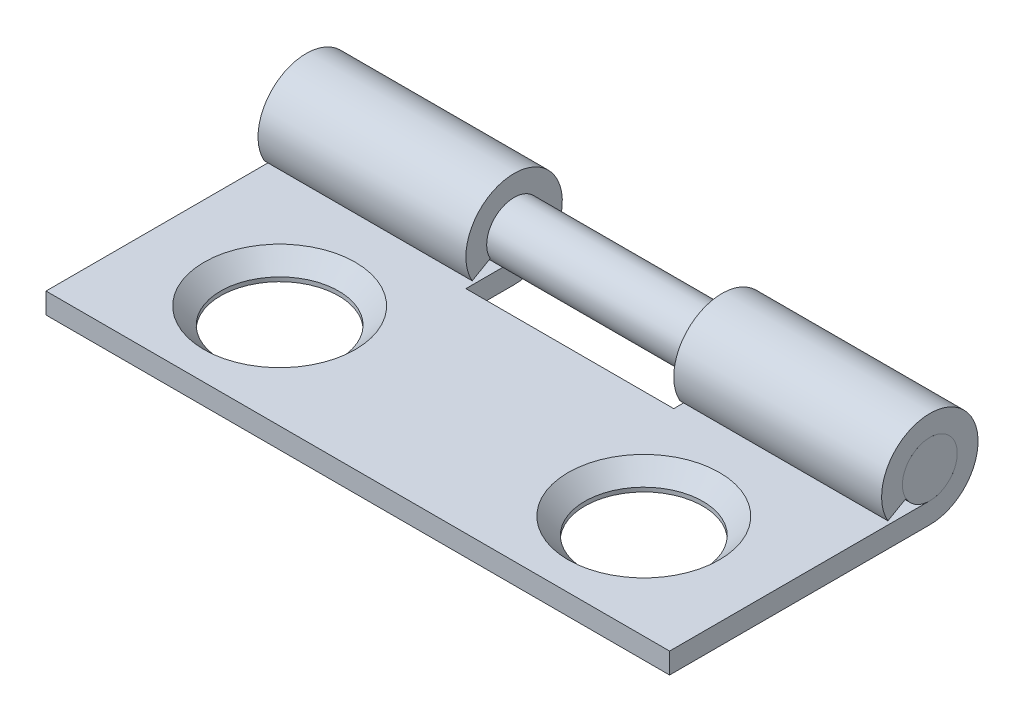
ISO-10303-21;
HEADER;
FILE_DESCRIPTION(('STEP AP214'),'2;1');
FILE_NAME('part.step','',(''),(''),'','','');
FILE_SCHEMA(('AUTOMOTIVE_DESIGN { 1 0 10303 214 1 1 1 1 }'));
ENDSEC;
DATA;
#1=APPLICATION_CONTEXT('core data for automotive mechanical design processes');
#2=APPLICATION_PROTOCOL_DEFINITION('international standard','automotive_design',2000,#1);
#3=PRODUCT_CONTEXT('',#1,'mechanical');
#4=PRODUCT('Part','Part','',(#3));
#5=PRODUCT_RELATED_PRODUCT_CATEGORY('part','',(#4));
#6=PRODUCT_DEFINITION_FORMATION('','',#4);
#7=PRODUCT_DEFINITION_CONTEXT('part definition',#1,'design');
#8=PRODUCT_DEFINITION('design','',#6,#7);
#9=PRODUCT_DEFINITION_SHAPE('','',#8);
#10=(LENGTH_UNIT() NAMED_UNIT(*) SI_UNIT(.MILLI.,.METRE.));
#11=(NAMED_UNIT(*) PLANE_ANGLE_UNIT() SI_UNIT($,.RADIAN.));
#12=(NAMED_UNIT(*) SI_UNIT($,.STERADIAN.) SOLID_ANGLE_UNIT());
#13=UNCERTAINTY_MEASURE_WITH_UNIT(LENGTH_MEASURE(1.E-05),#10,'distance_accuracy_value','');
#14=(GEOMETRIC_REPRESENTATION_CONTEXT(3) GLOBAL_UNCERTAINTY_ASSIGNED_CONTEXT((#13)) GLOBAL_UNIT_ASSIGNED_CONTEXT((#10,
#11,#12)) REPRESENTATION_CONTEXT('',''));
#15=CARTESIAN_POINT('',(0.,0.,0.));
#16=DIRECTION('',(0.,0.,1.));
#17=DIRECTION('',(1.,0.,0.));
#18=AXIS2_PLACEMENT_3D('',#15,#16,#17);
#19=CARTESIAN_POINT('',(9.525,0.,0.));
#20=DIRECTION('',(-1.,0.,0.));
#21=DIRECTION('',(0.,0.,1.));
#22=AXIS2_PLACEMENT_3D('',#19,#20,#21);
#23=CYLINDRICAL_SURFACE('',#22,0.8382);
#24=CARTESIAN_POINT('',(9.525,0.,0.));
#25=DIRECTION('',(1.,0.,0.));
#26=DIRECTION('',(0.,0.,-1.));
#27=AXIS2_PLACEMENT_3D('',#24,#25,#26);
#28=CIRCLE('',#27,0.8382);
#29=CARTESIAN_POINT('',(9.525,0.,0.8382));
#30=VERTEX_POINT('',#29);
#31=EDGE_CURVE('E11',#30,#30,#28,.T.);
#32=CARTESIAN_POINT('',(-9.525,0.,0.));
#33=DIRECTION('',(1.,0.,0.));
#34=DIRECTION('',(0.,0.,-1.));
#35=AXIS2_PLACEMENT_3D('',#32,#33,#34);
#36=CIRCLE('',#35,0.8382);
#37=CARTESIAN_POINT('',(-9.525,0.,0.8382));
#38=VERTEX_POINT('',#37);
#39=EDGE_CURVE('E56',#38,#38,#36,.T.);
#40=CARTESIAN_POINT('',(9.525,0.,0.8382));
#41=CARTESIAN_POINT('',(9.3265625,0.,0.8382));
#42=CARTESIAN_POINT('',(9.128125,0.,0.8382));
#43=CARTESIAN_POINT('',(8.73125,0.,0.8382));
#44=CARTESIAN_POINT('',(8.5328125,0.,0.8382));
#45=CARTESIAN_POINT('',(8.1359375,0.,0.8382));
#46=CARTESIAN_POINT('',(7.9375,0.,0.8382));
#47=CARTESIAN_POINT('',(7.540625,0.,0.8382));
#48=CARTESIAN_POINT('',(7.3421875,0.,0.8382));
#49=CARTESIAN_POINT('',(6.9453125,0.,0.8382));
#50=CARTESIAN_POINT('',(6.746875,0.,0.8382));
#51=CARTESIAN_POINT('',(6.35,0.,0.8382));
#52=CARTESIAN_POINT('',(6.1515625,0.,0.8382));
#53=CARTESIAN_POINT('',(5.7546875,0.,0.8382));
#54=CARTESIAN_POINT('',(5.55625,0.,0.8382));
#55=CARTESIAN_POINT('',(5.159375,0.,0.8382));
#56=CARTESIAN_POINT('',(4.9609375,0.,0.8382));
#57=CARTESIAN_POINT('',(4.5640625,0.,0.8382));
#58=CARTESIAN_POINT('',(4.365625,0.,0.8382));
#59=CARTESIAN_POINT('',(3.96875,0.,0.8382));
#60=CARTESIAN_POINT('',(3.7703125,0.,0.8382));
#61=CARTESIAN_POINT('',(3.3734375,0.,0.8382));
#62=CARTESIAN_POINT('',(3.175,0.,0.8382));
#63=CARTESIAN_POINT('',(2.778125,0.,0.8382));
#64=CARTESIAN_POINT('',(2.5796875,0.,0.8382));
#65=CARTESIAN_POINT('',(2.1828125,0.,0.8382));
#66=CARTESIAN_POINT('',(1.984375,0.,0.8382));
#67=CARTESIAN_POINT('',(1.5875,0.,0.8382));
#68=CARTESIAN_POINT('',(1.3890625,0.,0.8382));
#69=CARTESIAN_POINT('',(0.992187499999999,0.,0.8382));
#70=CARTESIAN_POINT('',(0.793749999999999,0.,0.8382));
#71=CARTESIAN_POINT('',(0.396874999999998,0.,0.8382));
#72=CARTESIAN_POINT('',(0.198437499999998,0.,0.8382));
#73=CARTESIAN_POINT('',(-0.198437500000002,0.,0.8382));
#74=CARTESIAN_POINT('',(-0.396875000000002,0.,0.8382));
#75=CARTESIAN_POINT('',(-0.793750000000002,0.,0.8382));
#76=CARTESIAN_POINT('',(-0.992187500000002,0.,0.8382));
#77=CARTESIAN_POINT('',(-1.3890625,0.,0.8382));
#78=CARTESIAN_POINT('',(-1.5875,0.,0.8382));
#79=CARTESIAN_POINT('',(-1.984375,0.,0.8382));
#80=CARTESIAN_POINT('',(-2.1828125,0.,0.8382));
#81=CARTESIAN_POINT('',(-2.5796875,0.,0.8382));
#82=CARTESIAN_POINT('',(-2.778125,0.,0.8382));
#83=CARTESIAN_POINT('',(-3.175,0.,0.8382));
#84=CARTESIAN_POINT('',(-3.3734375,0.,0.8382));
#85=CARTESIAN_POINT('',(-3.7703125,0.,0.8382));
#86=CARTESIAN_POINT('',(-3.96875,0.,0.8382));
#87=CARTESIAN_POINT('',(-4.365625,0.,0.8382));
#88=CARTESIAN_POINT('',(-4.5640625,0.,0.8382));
#89=CARTESIAN_POINT('',(-4.9609375,0.,0.8382));
#90=CARTESIAN_POINT('',(-5.159375,0.,0.8382));
#91=CARTESIAN_POINT('',(-5.55625,0.,0.8382));
#92=CARTESIAN_POINT('',(-5.7546875,0.,0.8382));
#93=CARTESIAN_POINT('',(-6.1515625,0.,0.8382));
#94=CARTESIAN_POINT('',(-6.35,0.,0.8382));
#95=CARTESIAN_POINT('',(-6.746875,0.,0.8382));
#96=CARTESIAN_POINT('',(-6.9453125,0.,0.8382));
#97=CARTESIAN_POINT('',(-7.3421875,0.,0.8382));
#98=CARTESIAN_POINT('',(-7.540625,0.,0.8382));
#99=CARTESIAN_POINT('',(-7.9375,0.,0.8382));
#100=CARTESIAN_POINT('',(-8.1359375,0.,0.8382));
#101=CARTESIAN_POINT('',(-8.5328125,0.,0.8382));
#102=CARTESIAN_POINT('',(-8.73125,0.,0.8382));
#103=CARTESIAN_POINT('',(-9.128125,0.,0.8382));
#104=CARTESIAN_POINT('',(-9.3265625,0.,0.8382));
#105=CARTESIAN_POINT('',(-9.525,0.,0.8382));
#106=B_SPLINE_CURVE_WITH_KNOTS('',3,(#40,#41,#42,#43,#44,#45,#46,#47,#48,#49,#50,#51,#52,#53,
#54,#55,#56,#57,#58,#59,#60,#61,#62,#63,#64,#65,#66,#67,#68,#69,#70,#71,#72,#73,#74,#75,#76,#77,
#78,#79,#80,#81,#82,#83,#84,#85,#86,#87,#88,#89,#90,#91,#92,#93,#94,#95,#96,#97,#98,#99,#100,
#101,#102,#103,#104,#105),.UNSPECIFIED.,.F.,.F.,(4,2,2,2,2,2,2,2,2,2,2,2,2,2,2,2,2,2,2,2,2,2,2,
2,2,2,2,2,2,2,2,2,4),(0.,0.595312499999999,1.190625,1.7859375,2.38125,2.9765625,3.571875,
4.1671875,4.7625,5.3578125,5.953125,6.5484375,7.14375,7.7390625,8.334375,8.9296875,9.525,
10.1203125,10.715625,11.3109375,11.90625,12.5015625,13.096875,13.6921875,14.2875,14.8828125,
15.478125,16.0734375,16.66875,17.2640625,17.859375,18.4546875,19.05),.UNSPECIFIED.);
#107=EDGE_CURVE('BSEAM53',#30,#38,#106,.T.);
#108=ORIENTED_EDGE('',*,*,#31,.F.);
#109=ORIENTED_EDGE('',*,*,#39,.T.);
#110=ORIENTED_EDGE('',*,*,#107,.T.);
#111=ORIENTED_EDGE('',*,*,#107,.F.);
#112=EDGE_LOOP('',(#108,#110,#109,#111));
#113=FACE_BOUND('',#112,.T.);
#114=ADVANCED_FACE('F53',(#113),#23,.T.);
#115=CARTESIAN_POINT('',(9.525,0.,0.));
#116=DIRECTION('',(1.,0.,0.));
#117=DIRECTION('',(0.,0.,-1.));
#118=AXIS2_PLACEMENT_3D('',#115,#116,#117);
#119=PLANE('',#118);
#120=ORIENTED_EDGE('',*,*,#31,.T.);
#121=EDGE_LOOP('',(#120));
#122=FACE_BOUND('',#121,.T.);
#123=ADVANCED_FACE('F68',(#122),#119,.T.);
#124=CARTESIAN_POINT('',(-9.525,0.,0.));
#125=DIRECTION('',(1.,0.,0.));
#126=DIRECTION('',(0.,0.,-1.));
#127=AXIS2_PLACEMENT_3D('',#124,#125,#126);
#128=PLANE('',#127);
#129=ORIENTED_EDGE('',*,*,#39,.F.);
#130=EDGE_LOOP('',(#129));
#131=FACE_BOUND('',#130,.T.);
#132=ADVANCED_FACE('F66',(#131),#128,.F.);
#133=CLOSED_SHELL('',(#114,#123,#132));
#134=MANIFOLD_SOLID_BREP('B2',#133);
#135=CARTESIAN_POINT('',(9.525,0.,0.));
#136=DIRECTION('',(-1.,0.,0.));
#137=DIRECTION('',(0.,0.,1.));
#138=AXIS2_PLACEMENT_3D('',#135,#136,#137);
#139=CYLINDRICAL_SURFACE('',#138,0.8382);
#140=DIRECTION('',(-1.,0.,0.));
#141=VECTOR('',#140,1.);
#142=CARTESIAN_POINT('',(9.525,-0.414510225725591,0.728533124002553));
#143=LINE('',#142,#141);
#144=CARTESIAN_POINT('',(9.525,-0.414510225725591,0.728533124002553));
#145=VERTEX_POINT('',#144);
#146=CARTESIAN_POINT('',(3.175,-0.414510225725591,0.728533124002553));
#147=VERTEX_POINT('',#146);
#148=EDGE_CURVE('E231',#145,#147,#143,.T.);
#149=ORIENTED_EDGE('',*,*,#148,.T.);
#150=CARTESIAN_POINT('',(3.175,0.,0.));
#151=DIRECTION('',(1.,0.,0.));
#152=DIRECTION('',(0.,0.,-1.));
#153=AXIS2_PLACEMENT_3D('',#150,#151,#152);
#154=CIRCLE('',#153,0.8382);
#155=CARTESIAN_POINT('',(3.175,-0.8382,0.));
#156=VERTEX_POINT('',#155);
#157=EDGE_CURVE('E301',#147,#156,#154,.F.);
#158=ORIENTED_EDGE('',*,*,#157,.T.);
#159=DIRECTION('',(-1.,0.,0.));
#160=VECTOR('',#159,1.);
#161=CARTESIAN_POINT('',(9.525,-0.8382,0.));
#162=LINE('',#161,#160);
#163=CARTESIAN_POINT('',(9.525,-0.8382,0.));
#164=VERTEX_POINT('',#163);
#165=EDGE_CURVE('E245',#164,#156,#162,.T.);
#166=ORIENTED_EDGE('',*,*,#165,.F.);
#167=CARTESIAN_POINT('',(9.525,0.,0.));
#168=DIRECTION('',(-1.,0.,0.));
#169=DIRECTION('',(0.,0.,1.));
#170=AXIS2_PLACEMENT_3D('',#167,#168,#169);
#171=CIRCLE('',#170,0.8382);
#172=EDGE_CURVE('E230',#145,#164,#171,.T.);
#173=ORIENTED_EDGE('',*,*,#172,.F.);
#174=EDGE_LOOP('',(#149,#158,#166,#173));
#175=FACE_BOUND('',#174,.T.);
#176=ADVANCED_FACE('F100',(#175),#139,.F.);
#177=CARTESIAN_POINT('',(9.525,0.,0.));
#178=DIRECTION('',(-1.,0.,0.));
#179=DIRECTION('',(0.,0.,1.));
#180=AXIS2_PLACEMENT_3D('',#177,#178,#179);
#181=CYLINDRICAL_SURFACE('',#180,1.47320000000008);
#182=CARTESIAN_POINT('',(3.175,0.,0.));
#183=DIRECTION('',(1.,0.,0.));
#184=DIRECTION('',(0.,0.,-1.));
#185=AXIS2_PLACEMENT_3D('',#182,#183,#184);
#186=CIRCLE('',#185,1.47320000000008);
#187=CARTESIAN_POINT('',(3.175,-1.4732,0.));
#188=VERTEX_POINT('',#187);
#189=CARTESIAN_POINT('',(3.175,-0.728533124002552,1.28045215733782));
#190=VERTEX_POINT('',#189);
#191=EDGE_CURVE('E302',#188,#190,#186,.T.);
#192=ORIENTED_EDGE('',*,*,#191,.T.);
#193=DIRECTION('',(-1.,0.,0.));
#194=VECTOR('',#193,1.);
#195=CARTESIAN_POINT('',(9.525,-0.728533124002553,1.28045215733782));
#196=LINE('',#195,#194);
#197=CARTESIAN_POINT('',(9.525,-0.728533124002553,1.28045215733782));
#198=VERTEX_POINT('',#197);
#199=EDGE_CURVE('E202',#198,#190,#196,.T.);
#200=ORIENTED_EDGE('',*,*,#199,.F.);
#201=CARTESIAN_POINT('',(9.525,0.,0.));
#202=DIRECTION('',(1.,0.,0.));
#203=DIRECTION('',(0.,0.,1.));
#204=AXIS2_PLACEMENT_3D('',#201,#202,#203);
#205=CIRCLE('',#204,1.47320000000008);
#206=CARTESIAN_POINT('',(9.525,-1.4732,0.));
#207=VERTEX_POINT('',#206);
#208=EDGE_CURVE('E177',#207,#198,#205,.T.);
#209=ORIENTED_EDGE('',*,*,#208,.F.);
#210=DIRECTION('',(-1.,0.,0.));
#211=VECTOR('',#210,1.);
#212=CARTESIAN_POINT('',(9.525,-1.4732,0.));
#213=LINE('',#212,#211);
#214=EDGE_CURVE('E188',#207,#188,#213,.T.);
#215=ORIENTED_EDGE('',*,*,#214,.T.);
#216=EDGE_LOOP('',(#192,#200,#209,#215));
#217=FACE_BOUND('',#216,.T.);
#218=ADVANCED_FACE('F200',(#217),#181,.T.);
#219=CARTESIAN_POINT('',(9.525,-0.414510225725591,0.728533124002553));
#220=DIRECTION('',(0.,0.869163832024043,0.49452424925506));
#221=DIRECTION('',(0.,-0.49452424925506,0.869163832024043));
#222=AXIS2_PLACEMENT_3D('',#219,#220,#221);
#223=PLANE('',#222);
#224=ORIENTED_EDGE('',*,*,#199,.T.);
#225=DIRECTION('',(0.,0.49452424925506,-0.869163832024043));
#226=VECTOR('',#225,1.);
#227=CARTESIAN_POINT('',(3.175,-0.414510225725591,0.728533124002554));
#228=LINE('',#227,#226);
#229=EDGE_CURVE('E51',#190,#147,#228,.T.);
#230=ORIENTED_EDGE('',*,*,#229,.T.);
#231=ORIENTED_EDGE('',*,*,#148,.F.);
#232=DIRECTION('',(0.,0.49452424925506,-0.869163832024043));
#233=VECTOR('',#232,1.);
#234=CARTESIAN_POINT('',(9.525,-0.414510225725591,0.728533124002553));
#235=LINE('',#234,#233);
#236=EDGE_CURVE('E127',#198,#145,#235,.T.);
#237=ORIENTED_EDGE('',*,*,#236,.F.);
#238=EDGE_LOOP('',(#224,#230,#231,#237));
#239=FACE_BOUND('',#238,.T.);
#240=ADVANCED_FACE('F378',(#239),#223,.F.);
#241=CARTESIAN_POINT('',(-3.175,-0.8382,0.));
#242=VERTEX_POINT('',#241);
#243=CARTESIAN_POINT('',(-9.525,-0.8382,0.));
#244=VERTEX_POINT('',#243);
#245=EDGE_CURVE('E244',#242,#244,#162,.T.);
#246=ORIENTED_EDGE('',*,*,#245,.F.);
#247=CARTESIAN_POINT('',(-3.175,0.,0.));
#248=DIRECTION('',(-1.,0.,0.));
#249=DIRECTION('',(0.,0.,1.));
#250=AXIS2_PLACEMENT_3D('',#247,#248,#249);
#251=CIRCLE('',#250,0.8382);
#252=CARTESIAN_POINT('',(-3.175,-0.414510225725591,0.728533124002553));
#253=VERTEX_POINT('',#252);
#254=EDGE_CURVE('E289',#242,#253,#251,.F.);
#255=ORIENTED_EDGE('',*,*,#254,.T.);
#256=CARTESIAN_POINT('',(-9.525,-0.414510225725591,0.728533124002553));
#257=VERTEX_POINT('',#256);
#258=EDGE_CURVE('E155',#253,#257,#143,.T.);
#259=ORIENTED_EDGE('',*,*,#258,.T.);
#260=CARTESIAN_POINT('',(-9.525,0.,0.));
#261=DIRECTION('',(-1.,0.,0.));
#262=DIRECTION('',(0.,0.,1.));
#263=AXIS2_PLACEMENT_3D('',#260,#261,#262);
#264=CIRCLE('',#263,0.8382);
#265=EDGE_CURVE('E209',#257,#244,#264,.T.);
#266=ORIENTED_EDGE('',*,*,#265,.T.);
#267=EDGE_LOOP('',(#246,#255,#259,#266));
#268=FACE_BOUND('',#267,.T.);
#269=ADVANCED_FACE('F102',(#268),#139,.F.);
#270=CARTESIAN_POINT('',(9.525,-0.8382,7.9502));
#271=DIRECTION('',(0.,-1.,0.));
#272=DIRECTION('',(0.,0.,-1.));
#273=AXIS2_PLACEMENT_3D('',#270,#271,#272);
#274=PLANE('',#273);
#275=CARTESIAN_POINT('',(5.5626,-0.8382,4.7752));
#276=DIRECTION('',(0.,1.,0.));
#277=DIRECTION('',(0.,0.,1.));
#278=AXIS2_PLACEMENT_3D('',#275,#276,#277);
#279=CIRCLE('',#278,2.3114);
#280=CARTESIAN_POINT('',(5.5626,-0.8382,7.0866));
#281=VERTEX_POINT('',#280);
#282=EDGE_CURVE('E268',#281,#281,#279,.T.);
#283=ORIENTED_EDGE('',*,*,#282,.F.);
#284=EDGE_LOOP('',(#283));
#285=FACE_BOUND('',#284,.T.);
#286=CARTESIAN_POINT('',(-5.5626,-0.8382,4.7752));
#287=DIRECTION('',(0.,1.,0.));
#288=DIRECTION('',(0.,0.,1.));
#289=AXIS2_PLACEMENT_3D('',#286,#287,#288);
#290=CIRCLE('',#289,2.3114);
#291=CARTESIAN_POINT('',(-5.5626,-0.8382,7.0866));
#292=VERTEX_POINT('',#291);
#293=EDGE_CURVE('E258',#292,#292,#290,.T.);
#294=ORIENTED_EDGE('',*,*,#293,.F.);
#295=EDGE_LOOP('',(#294));
#296=FACE_BOUND('',#295,.T.);
#297=ORIENTED_EDGE('',*,*,#165,.T.);
#298=DIRECTION('',(0.,0.,1.));
#299=VECTOR('',#298,1.);
#300=CARTESIAN_POINT('',(3.175,-0.8382,7.9502));
#301=LINE('',#300,#299);
#302=CARTESIAN_POINT('',(3.175,-0.8382,1.47320000000012));
#303=VERTEX_POINT('',#302);
#304=EDGE_CURVE('E305',#156,#303,#301,.T.);
#305=ORIENTED_EDGE('',*,*,#304,.T.);
#306=DIRECTION('',(-1.,0.,0.));
#307=VECTOR('',#306,1.);
#308=CARTESIAN_POINT('',(9.525,-0.8382,1.47320000000012));
#309=LINE('',#308,#307);
#310=CARTESIAN_POINT('',(-3.175,-0.8382,1.47320000000012));
#311=VERTEX_POINT('',#310);
#312=EDGE_CURVE('E213',#303,#311,#309,.T.);
#313=ORIENTED_EDGE('',*,*,#312,.T.);
#314=DIRECTION('',(0.,0.,-1.));
#315=VECTOR('',#314,1.);
#316=CARTESIAN_POINT('',(-3.175,-0.8382,7.9502));
#317=LINE('',#316,#315);
#318=EDGE_CURVE('E295',#311,#242,#317,.T.);
#319=ORIENTED_EDGE('',*,*,#318,.T.);
#320=ORIENTED_EDGE('',*,*,#245,.T.);
#321=DIRECTION('',(0.,0.,1.));
#322=VECTOR('',#321,1.);
#323=CARTESIAN_POINT('',(-9.525,-0.8382,7.9502));
#324=LINE('',#323,#322);
#325=CARTESIAN_POINT('',(-9.525,-0.8382,7.9502));
#326=VERTEX_POINT('',#325);
#327=EDGE_CURVE('E212',#244,#326,#324,.T.);
#328=ORIENTED_EDGE('',*,*,#327,.T.);
#329=DIRECTION('',(-1.,0.,0.));
#330=VECTOR('',#329,1.);
#331=CARTESIAN_POINT('',(9.525,-0.8382,7.9502));
#332=LINE('',#331,#330);
#333=CARTESIAN_POINT('',(9.525,-0.8382,7.9502));
#334=VERTEX_POINT('',#333);
#335=EDGE_CURVE('E240',#334,#326,#332,.T.);
#336=ORIENTED_EDGE('',*,*,#335,.F.);
#337=DIRECTION('',(0.,0.,1.));
#338=VECTOR('',#337,1.);
#339=CARTESIAN_POINT('',(9.525,-0.8382,7.9502));
#340=LINE('',#339,#338);
#341=EDGE_CURVE('E164',#164,#334,#340,.T.);
#342=ORIENTED_EDGE('',*,*,#341,.F.);
#343=EDGE_LOOP('',(#297,#305,#313,#319,#320,#328,#336,#342));
#344=FACE_BOUND('',#343,.T.);
#345=ADVANCED_FACE('F321',(#285,#296,#344),#274,.F.);
#346=CARTESIAN_POINT('',(9.525,-1.4732,7.9502));
#347=DIRECTION('',(0.,0.,-1.));
#348=DIRECTION('',(-1.,0.,0.));
#349=AXIS2_PLACEMENT_3D('',#346,#347,#348);
#350=PLANE('',#349);
#351=DIRECTION('',(0.,-1.,0.));
#352=VECTOR('',#351,1.);
#353=CARTESIAN_POINT('',(-9.525,-1.4732,7.9502));
#354=LINE('',#353,#352);
#355=CARTESIAN_POINT('',(-9.525,-1.4732,7.9502));
#356=VERTEX_POINT('',#355);
#357=EDGE_CURVE('E216',#326,#356,#354,.T.);
#358=ORIENTED_EDGE('',*,*,#357,.T.);
#359=DIRECTION('',(-1.,0.,0.));
#360=VECTOR('',#359,1.);
#361=CARTESIAN_POINT('',(9.525,-1.4732,7.9502));
#362=LINE('',#361,#360);
#363=CARTESIAN_POINT('',(9.525,-1.4732,7.9502));
#364=VERTEX_POINT('',#363);
#365=EDGE_CURVE('E197',#364,#356,#362,.T.);
#366=ORIENTED_EDGE('',*,*,#365,.F.);
#367=DIRECTION('',(0.,-1.,0.));
#368=VECTOR('',#367,1.);
#369=CARTESIAN_POINT('',(9.525,-1.4732,7.9502));
#370=LINE('',#369,#368);
#371=EDGE_CURVE('E180',#334,#364,#370,.T.);
#372=ORIENTED_EDGE('',*,*,#371,.F.);
#373=ORIENTED_EDGE('',*,*,#335,.T.);
#374=EDGE_LOOP('',(#358,#366,#372,#373));
#375=FACE_BOUND('',#374,.T.);
#376=ADVANCED_FACE('F325',(#375),#350,.F.);
#377=CARTESIAN_POINT('',(9.525,-1.4732,0.));
#378=DIRECTION('',(0.,1.,0.));
#379=DIRECTION('',(0.,0.,1.));
#380=AXIS2_PLACEMENT_3D('',#377,#378,#379);
#381=PLANE('',#380);
#382=CARTESIAN_POINT('',(5.5626,-1.4732,4.7752));
#383=DIRECTION('',(0.,1.,0.));
#384=DIRECTION('',(0.,0.,1.));
#385=AXIS2_PLACEMENT_3D('',#382,#383,#384);
#386=CIRCLE('',#385,1.8034);
#387=CARTESIAN_POINT('',(5.5626,-1.4732,6.5786));
#388=VERTEX_POINT('',#387);
#389=EDGE_CURVE('E252',#388,#388,#386,.T.);
#390=ORIENTED_EDGE('',*,*,#389,.T.);
#391=EDGE_LOOP('',(#390));
#392=FACE_BOUND('',#391,.T.);
#393=CARTESIAN_POINT('',(-5.5626,-1.4732,4.7752));
#394=DIRECTION('',(0.,1.,0.));
#395=DIRECTION('',(0.,0.,1.));
#396=AXIS2_PLACEMENT_3D('',#393,#394,#395);
#397=CIRCLE('',#396,1.8034);
#398=CARTESIAN_POINT('',(-5.5626,-1.4732,6.5786));
#399=VERTEX_POINT('',#398);
#400=EDGE_CURVE('E260',#399,#399,#397,.T.);
#401=ORIENTED_EDGE('',*,*,#400,.T.);
#402=EDGE_LOOP('',(#401));
#403=FACE_BOUND('',#402,.T.);
#404=DIRECTION('',(1.,0.,0.));
#405=VECTOR('',#404,1.);
#406=CARTESIAN_POINT('',(3.175,-1.4732,1.47320000000012));
#407=LINE('',#406,#405);
#408=CARTESIAN_POINT('',(-3.175,-1.4732,1.47320000000012));
#409=VERTEX_POINT('',#408);
#410=CARTESIAN_POINT('',(3.175,-1.4732,1.47320000000012));
#411=VERTEX_POINT('',#410);
#412=EDGE_CURVE('E281',#409,#411,#407,.T.);
#413=ORIENTED_EDGE('',*,*,#412,.T.);
#414=DIRECTION('',(0.,0.,-1.));
#415=VECTOR('',#414,1.);
#416=CARTESIAN_POINT('',(3.175,-1.4732,-1.47320000000013));
#417=LINE('',#416,#415);
#418=EDGE_CURVE('E193',#411,#188,#417,.T.);
#419=ORIENTED_EDGE('',*,*,#418,.T.);
#420=ORIENTED_EDGE('',*,*,#214,.F.);
#421=DIRECTION('',(0.,0.,-1.));
#422=VECTOR('',#421,1.);
#423=CARTESIAN_POINT('',(9.525,-1.4732,0.));
#424=LINE('',#423,#422);
#425=EDGE_CURVE('E173',#364,#207,#424,.T.);
#426=ORIENTED_EDGE('',*,*,#425,.F.);
#427=ORIENTED_EDGE('',*,*,#365,.T.);
#428=DIRECTION('',(0.,0.,-1.));
#429=VECTOR('',#428,1.);
#430=CARTESIAN_POINT('',(-9.525,-1.4732,0.));
#431=LINE('',#430,#429);
#432=CARTESIAN_POINT('',(-9.525,-1.4732,0.));
#433=VERTEX_POINT('',#432);
#434=EDGE_CURVE('E219',#356,#433,#431,.T.);
#435=ORIENTED_EDGE('',*,*,#434,.T.);
#436=CARTESIAN_POINT('',(-3.175,-1.4732,0.));
#437=VERTEX_POINT('',#436);
#438=EDGE_CURVE('E198',#437,#433,#213,.T.);
#439=ORIENTED_EDGE('',*,*,#438,.F.);
#440=DIRECTION('',(0.,0.,1.));
#441=VECTOR('',#440,1.);
#442=CARTESIAN_POINT('',(-3.175,-1.4732,1.47320000000012));
#443=LINE('',#442,#441);
#444=EDGE_CURVE('E277',#437,#409,#443,.T.);
#445=ORIENTED_EDGE('',*,*,#444,.T.);
#446=EDGE_LOOP('',(#413,#419,#420,#426,#427,#435,#439,#445));
#447=FACE_BOUND('',#446,.T.);
#448=ADVANCED_FACE('F190',(#392,#403,#447),#381,.F.);
#449=CARTESIAN_POINT('',(-3.175,-0.728533124002553,1.28045215733782));
#450=VERTEX_POINT('',#449);
#451=CARTESIAN_POINT('',(-9.525,-0.728533124002553,1.28045215733782));
#452=VERTEX_POINT('',#451);
#453=EDGE_CURVE('E235',#450,#452,#196,.T.);
#454=ORIENTED_EDGE('',*,*,#453,.F.);
#455=CARTESIAN_POINT('',(-3.175,0.,0.));
#456=DIRECTION('',(-1.,0.,0.));
#457=DIRECTION('',(0.,0.,1.));
#458=AXIS2_PLACEMENT_3D('',#455,#456,#457);
#459=CIRCLE('',#458,1.47320000000008);
#460=EDGE_CURVE('E118',#450,#437,#459,.T.);
#461=ORIENTED_EDGE('',*,*,#460,.T.);
#462=ORIENTED_EDGE('',*,*,#438,.T.);
#463=CARTESIAN_POINT('',(-9.525,0.,0.));
#464=DIRECTION('',(1.,0.,0.));
#465=DIRECTION('',(0.,0.,1.));
#466=AXIS2_PLACEMENT_3D('',#463,#464,#465);
#467=CIRCLE('',#466,1.47320000000008);
#468=EDGE_CURVE('E223',#433,#452,#467,.T.);
#469=ORIENTED_EDGE('',*,*,#468,.T.);
#470=EDGE_LOOP('',(#454,#461,#462,#469));
#471=FACE_BOUND('',#470,.T.);
#472=ADVANCED_FACE('F335',(#471),#181,.T.);
#473=ORIENTED_EDGE('',*,*,#258,.F.);
#474=DIRECTION('',(0.,-0.49452424925506,0.869163832024043));
#475=VECTOR('',#474,1.);
#476=CARTESIAN_POINT('',(-3.175,-0.414510225725592,0.728533124002554));
#477=LINE('',#476,#475);
#478=EDGE_CURVE('E110',#253,#450,#477,.T.);
#479=ORIENTED_EDGE('',*,*,#478,.T.);
#480=ORIENTED_EDGE('',*,*,#453,.T.);
#481=DIRECTION('',(0.,0.49452424925506,-0.869163832024043));
#482=VECTOR('',#481,1.);
#483=CARTESIAN_POINT('',(-9.525,-0.414510225725591,0.728533124002553));
#484=LINE('',#483,#482);
#485=EDGE_CURVE('E227',#452,#257,#484,.T.);
#486=ORIENTED_EDGE('',*,*,#485,.T.);
#487=EDGE_LOOP('',(#473,#479,#480,#486));
#488=FACE_BOUND('',#487,.T.);
#489=ADVANCED_FACE('F341',(#488),#223,.F.);
#490=CARTESIAN_POINT('',(9.525,0.,0.));
#491=DIRECTION('',(-1.,0.,0.));
#492=DIRECTION('',(0.,0.,1.));
#493=AXIS2_PLACEMENT_3D('',#490,#491,#492);
#494=PLANE('',#493);
#495=ORIENTED_EDGE('',*,*,#172,.T.);
#496=ORIENTED_EDGE('',*,*,#341,.T.);
#497=ORIENTED_EDGE('',*,*,#371,.T.);
#498=ORIENTED_EDGE('',*,*,#425,.T.);
#499=ORIENTED_EDGE('',*,*,#208,.T.);
#500=ORIENTED_EDGE('',*,*,#236,.T.);
#501=EDGE_LOOP('',(#495,#496,#497,#498,#499,#500));
#502=FACE_BOUND('',#501,.T.);
#503=ADVANCED_FACE('F175',(#502),#494,.F.);
#504=CARTESIAN_POINT('',(-9.525,0.,0.));
#505=DIRECTION('',(-1.,0.,0.));
#506=DIRECTION('',(0.,0.,1.));
#507=AXIS2_PLACEMENT_3D('',#504,#505,#506);
#508=PLANE('',#507);
#509=ORIENTED_EDGE('',*,*,#265,.F.);
#510=ORIENTED_EDGE('',*,*,#485,.F.);
#511=ORIENTED_EDGE('',*,*,#468,.F.);
#512=ORIENTED_EDGE('',*,*,#434,.F.);
#513=ORIENTED_EDGE('',*,*,#357,.F.);
#514=ORIENTED_EDGE('',*,*,#327,.F.);
#515=EDGE_LOOP('',(#509,#510,#511,#512,#513,#514));
#516=FACE_BOUND('',#515,.T.);
#517=ADVANCED_FACE('F331',(#516),#508,.T.);
#518=CARTESIAN_POINT('',(3.175,-1.4732,1.47320000000012));
#519=DIRECTION('',(0.,0.,1.));
#520=DIRECTION('',(1.,0.,0.));
#521=AXIS2_PLACEMENT_3D('',#518,#519,#520);
#522=PLANE('',#521);
#523=DIRECTION('',(0.,1.,0.));
#524=VECTOR('',#523,1.);
#525=CARTESIAN_POINT('',(3.175,-1.4732,1.47320000000012));
#526=LINE('',#525,#524);
#527=EDGE_CURVE('E285',#411,#303,#526,.T.);
#528=ORIENTED_EDGE('',*,*,#527,.F.);
#529=ORIENTED_EDGE('',*,*,#412,.F.);
#530=DIRECTION('',(0.,1.,0.));
#531=VECTOR('',#530,1.);
#532=CARTESIAN_POINT('',(-3.175,-1.4732,1.47320000000012));
#533=LINE('',#532,#531);
#534=EDGE_CURVE('E284',#409,#311,#533,.T.);
#535=ORIENTED_EDGE('',*,*,#534,.T.);
#536=ORIENTED_EDGE('',*,*,#312,.F.);
#537=EDGE_LOOP('',(#528,#529,#535,#536));
#538=FACE_BOUND('',#537,.T.);
#539=ADVANCED_FACE('F361',(#538),#522,.F.);
#540=CARTESIAN_POINT('',(3.175,-1.4732,-1.47320000000013));
#541=DIRECTION('',(1.,0.,0.));
#542=DIRECTION('',(0.,0.,-1.));
#543=AXIS2_PLACEMENT_3D('',#540,#541,#542);
#544=PLANE('',#543);
#545=ORIENTED_EDGE('',*,*,#157,.F.);
#546=ORIENTED_EDGE('',*,*,#229,.F.);
#547=ORIENTED_EDGE('',*,*,#191,.F.);
#548=ORIENTED_EDGE('',*,*,#418,.F.);
#549=ORIENTED_EDGE('',*,*,#527,.T.);
#550=ORIENTED_EDGE('',*,*,#304,.F.);
#551=EDGE_LOOP('',(#545,#546,#547,#548,#549,#550));
#552=FACE_BOUND('',#551,.T.);
#553=ADVANCED_FACE('F375',(#552),#544,.F.);
#554=CARTESIAN_POINT('',(-3.175,-1.4732,1.47320000000012));
#555=DIRECTION('',(-1.,0.,0.));
#556=DIRECTION('',(0.,0.,1.));
#557=AXIS2_PLACEMENT_3D('',#554,#555,#556);
#558=PLANE('',#557);
#559=ORIENTED_EDGE('',*,*,#460,.F.);
#560=ORIENTED_EDGE('',*,*,#478,.F.);
#561=ORIENTED_EDGE('',*,*,#254,.F.);
#562=ORIENTED_EDGE('',*,*,#318,.F.);
#563=ORIENTED_EDGE('',*,*,#534,.F.);
#564=ORIENTED_EDGE('',*,*,#444,.F.);
#565=EDGE_LOOP('',(#559,#560,#561,#562,#563,#564));
#566=FACE_BOUND('',#565,.T.);
#567=ADVANCED_FACE('F344',(#566),#558,.F.);
#568=CARTESIAN_POINT('',(-5.5626,-0.8382,4.7752));
#569=DIRECTION('',(0.,1.,0.));
#570=DIRECTION('',(0.,0.,1.));
#571=AXIS2_PLACEMENT_3D('',#568,#569,#570);
#572=CONICAL_SURFACE('',#571,2.3114,0.78539816339745);
#573=CARTESIAN_POINT('',(-5.5626,-1.3462,4.7752));
#574=DIRECTION('',(0.,1.,0.));
#575=DIRECTION('',(0.,0.,1.));
#576=AXIS2_PLACEMENT_3D('',#573,#574,#575);
#577=CIRCLE('',#576,1.8034);
#578=CARTESIAN_POINT('',(-5.5626,-1.3462,6.5786));
#579=VERTEX_POINT('',#578);
#580=EDGE_CURVE('E104',#579,#579,#577,.F.);
#581=ORIENTED_EDGE('',*,*,#580,.T.);
#582=EDGE_LOOP('',(#581));
#583=FACE_BOUND('',#582,.T.);
#584=ORIENTED_EDGE('',*,*,#293,.T.);
#585=EDGE_LOOP('',(#584));
#586=FACE_BOUND('',#585,.T.);
#587=ADVANCED_FACE('F458',(#583,#586),#572,.F.);
#588=CARTESIAN_POINT('',(5.5626,-0.8382,4.7752));
#589=DIRECTION('',(0.,1.,0.));
#590=DIRECTION('',(0.,0.,1.));
#591=AXIS2_PLACEMENT_3D('',#588,#589,#590);
#592=CONICAL_SURFACE('',#591,2.3114,0.78539816339745);
#593=CARTESIAN_POINT('',(5.5626,-1.3462,4.7752));
#594=DIRECTION('',(0.,1.,0.));
#595=DIRECTION('',(0.,0.,1.));
#596=AXIS2_PLACEMENT_3D('',#593,#594,#595);
#597=CIRCLE('',#596,1.8034);
#598=CARTESIAN_POINT('',(5.5626,-1.3462,6.5786));
#599=VERTEX_POINT('',#598);
#600=EDGE_CURVE('E249',#599,#599,#597,.F.);
#601=ORIENTED_EDGE('',*,*,#600,.T.);
#602=EDGE_LOOP('',(#601));
#603=FACE_BOUND('',#602,.T.);
#604=ORIENTED_EDGE('',*,*,#282,.T.);
#605=EDGE_LOOP('',(#604));
#606=FACE_BOUND('',#605,.T.);
#607=ADVANCED_FACE('F484',(#603,#606),#592,.F.);
#608=CARTESIAN_POINT('',(5.5626,-1.4732,4.7752));
#609=DIRECTION('',(0.,1.,0.));
#610=DIRECTION('',(0.,0.,1.));
#611=AXIS2_PLACEMENT_3D('',#608,#609,#610);
#612=CYLINDRICAL_SURFACE('',#611,1.8034);
#613=ORIENTED_EDGE('',*,*,#389,.F.);
#614=EDGE_LOOP('',(#613));
#615=FACE_BOUND('',#614,.T.);
#616=ORIENTED_EDGE('',*,*,#600,.F.);
#617=EDGE_LOOP('',(#616));
#618=FACE_BOUND('',#617,.T.);
#619=ADVANCED_FACE('F495',(#615,#618),#612,.F.);
#620=CARTESIAN_POINT('',(-5.5626,-1.4732,4.7752));
#621=DIRECTION('',(0.,1.,0.));
#622=DIRECTION('',(0.,0.,1.));
#623=AXIS2_PLACEMENT_3D('',#620,#621,#622);
#624=CYLINDRICAL_SURFACE('',#623,1.8034);
#625=ORIENTED_EDGE('',*,*,#400,.F.);
#626=EDGE_LOOP('',(#625));
#627=FACE_BOUND('',#626,.T.);
#628=ORIENTED_EDGE('',*,*,#580,.F.);
#629=EDGE_LOOP('',(#628));
#630=FACE_BOUND('',#629,.T.);
#631=ADVANCED_FACE('F505',(#627,#630),#624,.F.);
#632=CLOSED_SHELL('',(#176,#218,#240,#269,#345,#376,#448,#472,#489,#503,#517,#539,#553,#567,
#587,#607,#619,#631));
#633=MANIFOLD_SOLID_BREP('B6',#632);
#634=ADVANCED_BREP_SHAPE_REPRESENTATION('',(#18,#134,#633),#14);
#635=SHAPE_DEFINITION_REPRESENTATION(#9,#634);
ENDSEC;
END-ISO-10303-21;
